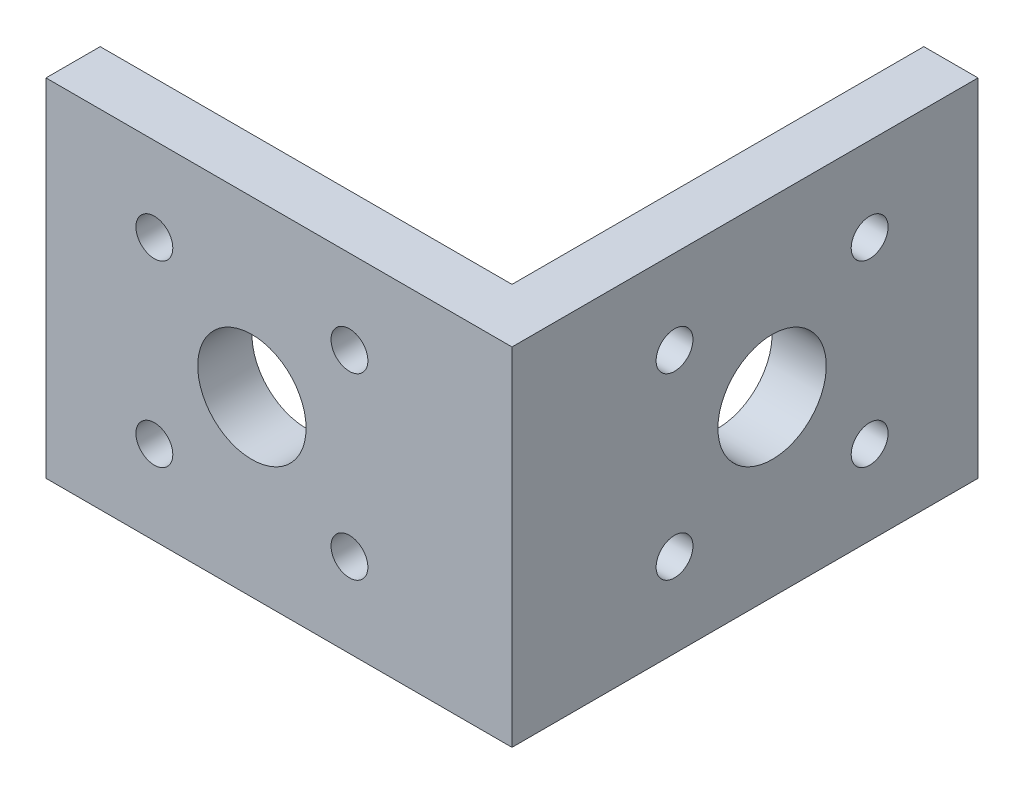
ISO-10303-21;
HEADER;
FILE_DESCRIPTION(('STEP AP214'),'2;1');
FILE_NAME('part.step','',(''),(''),'','','');
FILE_SCHEMA(('AUTOMOTIVE_DESIGN { 1 0 10303 214 1 1 1 1 }'));
ENDSEC;
DATA;
#1=APPLICATION_CONTEXT('core data for automotive mechanical design processes');
#2=APPLICATION_PROTOCOL_DEFINITION('international standard','automotive_design',2000,#1);
#3=PRODUCT_CONTEXT('',#1,'mechanical');
#4=PRODUCT('Part','Part','',(#3));
#5=PRODUCT_RELATED_PRODUCT_CATEGORY('part','',(#4));
#6=PRODUCT_DEFINITION_FORMATION('','',#4);
#7=PRODUCT_DEFINITION_CONTEXT('part definition',#1,'design');
#8=PRODUCT_DEFINITION('design','',#6,#7);
#9=PRODUCT_DEFINITION_SHAPE('','',#8);
#10=(LENGTH_UNIT() NAMED_UNIT(*) SI_UNIT(.MILLI.,.METRE.));
#11=(NAMED_UNIT(*) PLANE_ANGLE_UNIT() SI_UNIT($,.RADIAN.));
#12=(NAMED_UNIT(*) SI_UNIT($,.STERADIAN.) SOLID_ANGLE_UNIT());
#13=UNCERTAINTY_MEASURE_WITH_UNIT(LENGTH_MEASURE(1.E-05),#10,'distance_accuracy_value','');
#14=(GEOMETRIC_REPRESENTATION_CONTEXT(3) GLOBAL_UNCERTAINTY_ASSIGNED_CONTEXT((#13)) GLOBAL_UNIT_ASSIGNED_CONTEXT((#10,
#11,#12)) REPRESENTATION_CONTEXT('',''));
#15=CARTESIAN_POINT('',(0.,0.,0.));
#16=DIRECTION('',(0.,0.,1.));
#17=DIRECTION('',(1.,0.,0.));
#18=AXIS2_PLACEMENT_3D('',#15,#16,#17);
#19=CARTESIAN_POINT('',(0.,0.,0.));
#20=DIRECTION('',(0.,0.,1.));
#21=DIRECTION('',(1.,0.,0.));
#22=AXIS2_PLACEMENT_3D('',#19,#20,#21);
#23=PLANE('',#22);
#24=CARTESIAN_POINT('',(-8.99999999999983,-8.25,0.));
#25=DIRECTION('',(0.,0.,1.));
#26=DIRECTION('',(1.,0.,0.));
#27=AXIS2_PLACEMENT_3D('',#24,#25,#26);
#28=CIRCLE('',#27,1.7);
#29=CARTESIAN_POINT('',(-7.29999999999983,-8.25,0.));
#30=VERTEX_POINT('',#29);
#31=EDGE_CURVE('E143',#30,#30,#28,.T.);
#32=ORIENTED_EDGE('',*,*,#31,.T.);
#33=EDGE_LOOP('',(#32));
#34=FACE_BOUND('',#33,.T.);
#35=CARTESIAN_POINT('',(9.00000000000017,-8.24999999999975,0.));
#36=DIRECTION('',(0.,0.,1.));
#37=DIRECTION('',(1.,0.,0.));
#38=AXIS2_PLACEMENT_3D('',#35,#36,#37);
#39=CIRCLE('',#38,1.7);
#40=CARTESIAN_POINT('',(10.7000000000002,-8.24999999999975,0.));
#41=VERTEX_POINT('',#40);
#42=EDGE_CURVE('E135',#41,#41,#39,.T.);
#43=ORIENTED_EDGE('',*,*,#42,.T.);
#44=EDGE_LOOP('',(#43));
#45=FACE_BOUND('',#44,.T.);
#46=CARTESIAN_POINT('',(9.,8.25000000000025,0.));
#47=DIRECTION('',(0.,0.,1.));
#48=DIRECTION('',(1.,0.,0.));
#49=AXIS2_PLACEMENT_3D('',#46,#47,#48);
#50=CIRCLE('',#49,1.7);
#51=CARTESIAN_POINT('',(10.7,8.25000000000025,0.));
#52=VERTEX_POINT('',#51);
#53=EDGE_CURVE('E127',#52,#52,#50,.T.);
#54=ORIENTED_EDGE('',*,*,#53,.T.);
#55=EDGE_LOOP('',(#54));
#56=FACE_BOUND('',#55,.T.);
#57=CARTESIAN_POINT('',(-9.00000000000001,8.24999999999988,0.));
#58=DIRECTION('',(0.,0.,1.));
#59=DIRECTION('',(1.,0.,0.));
#60=AXIS2_PLACEMENT_3D('',#57,#58,#59);
#61=CIRCLE('',#60,1.70000000000004);
#62=CARTESIAN_POINT('',(-7.29999999999997,8.24999999999988,0.));
#63=VERTEX_POINT('',#62);
#64=EDGE_CURVE('E119',#63,#63,#61,.T.);
#65=ORIENTED_EDGE('',*,*,#64,.T.);
#66=EDGE_LOOP('',(#65));
#67=FACE_BOUND('',#66,.T.);
#68=CARTESIAN_POINT('',(0.,0.,0.));
#69=DIRECTION('',(0.,0.,1.));
#70=DIRECTION('',(1.,0.,0.));
#71=AXIS2_PLACEMENT_3D('',#68,#69,#70);
#72=CIRCLE('',#71,5.);
#73=CARTESIAN_POINT('',(4.99999999999999,0.,0.));
#74=VERTEX_POINT('',#73);
#75=EDGE_CURVE('E111',#74,#74,#72,.T.);
#76=ORIENTED_EDGE('',*,*,#75,.T.);
#77=EDGE_LOOP('',(#76));
#78=FACE_BOUND('',#77,.T.);
#79=DIRECTION('',(0.,1.,0.));
#80=VECTOR('',#79,1.);
#81=CARTESIAN_POINT('',(19.,16.,0.));
#82=LINE('',#81,#80);
#83=CARTESIAN_POINT('',(19.,-16.,0.));
#84=VERTEX_POINT('',#83);
#85=CARTESIAN_POINT('',(19.,16.,0.));
#86=VERTEX_POINT('',#85);
#87=EDGE_CURVE('E61',#84,#86,#82,.T.);
#88=ORIENTED_EDGE('',*,*,#87,.F.);
#89=DIRECTION('',(1.,0.,0.));
#90=VECTOR('',#89,1.);
#91=CARTESIAN_POINT('',(-19.,-16.,0.));
#92=LINE('',#91,#90);
#93=CARTESIAN_POINT('',(-19.,-16.,0.));
#94=VERTEX_POINT('',#93);
#95=EDGE_CURVE('E88',#94,#84,#92,.T.);
#96=ORIENTED_EDGE('',*,*,#95,.F.);
#97=DIRECTION('',(0.,-1.,0.));
#98=VECTOR('',#97,1.);
#99=CARTESIAN_POINT('',(-19.,16.,0.));
#100=LINE('',#99,#98);
#101=CARTESIAN_POINT('',(-19.,16.,0.));
#102=VERTEX_POINT('',#101);
#103=EDGE_CURVE('E82',#102,#94,#100,.T.);
#104=ORIENTED_EDGE('',*,*,#103,.F.);
#105=DIRECTION('',(-1.,0.,0.));
#106=VECTOR('',#105,1.);
#107=CARTESIAN_POINT('',(-19.,16.,0.));
#108=LINE('',#107,#106);
#109=EDGE_CURVE('E89',#86,#102,#108,.T.);
#110=ORIENTED_EDGE('',*,*,#109,.F.);
#111=EDGE_LOOP('',(#88,#96,#104,#110));
#112=FACE_BOUND('',#111,.T.);
#113=ADVANCED_FACE('F45',(#34,#45,#56,#67,#78,#112),#23,.F.);
#114=CARTESIAN_POINT('',(0.,0.,5.));
#115=DIRECTION('',(0.,0.,1.));
#116=DIRECTION('',(1.,0.,0.));
#117=AXIS2_PLACEMENT_3D('',#114,#115,#116);
#118=PLANE('',#117);
#119=CARTESIAN_POINT('',(9.00000000000017,-8.24999999999975,5.));
#120=DIRECTION('',(0.,0.,1.));
#121=DIRECTION('',(1.,0.,0.));
#122=AXIS2_PLACEMENT_3D('',#119,#120,#121);
#123=CIRCLE('',#122,1.7);
#124=CARTESIAN_POINT('',(10.7000000000002,-8.24999999999975,5.));
#125=VERTEX_POINT('',#124);
#126=EDGE_CURVE('E131',#125,#125,#123,.T.);
#127=ORIENTED_EDGE('',*,*,#126,.F.);
#128=EDGE_LOOP('',(#127));
#129=FACE_BOUND('',#128,.T.);
#130=CARTESIAN_POINT('',(-9.00000000000001,8.24999999999988,5.));
#131=DIRECTION('',(0.,0.,1.));
#132=DIRECTION('',(1.,0.,0.));
#133=AXIS2_PLACEMENT_3D('',#130,#131,#132);
#134=CIRCLE('',#133,1.70000000000004);
#135=CARTESIAN_POINT('',(-7.29999999999997,8.24999999999988,5.));
#136=VERTEX_POINT('',#135);
#137=EDGE_CURVE('E115',#136,#136,#134,.T.);
#138=ORIENTED_EDGE('',*,*,#137,.F.);
#139=EDGE_LOOP('',(#138));
#140=FACE_BOUND('',#139,.T.);
#141=DIRECTION('',(1.,0.,0.));
#142=VECTOR('',#141,1.);
#143=CARTESIAN_POINT('',(-19.,-16.,5.));
#144=LINE('',#143,#142);
#145=CARTESIAN_POINT('',(-19.,-16.,5.));
#146=VERTEX_POINT('',#145);
#147=CARTESIAN_POINT('',(24.,-16.,5.));
#148=VERTEX_POINT('',#147);
#149=EDGE_CURVE('E96',#146,#148,#144,.T.);
#150=ORIENTED_EDGE('',*,*,#149,.T.);
#151=DIRECTION('',(0.,1.,0.));
#152=VECTOR('',#151,1.);
#153=CARTESIAN_POINT('',(24.,16.,5.));
#154=LINE('',#153,#152);
#155=CARTESIAN_POINT('',(24.,16.,5.));
#156=VERTEX_POINT('',#155);
#157=EDGE_CURVE('E158',#148,#156,#154,.T.);
#158=ORIENTED_EDGE('',*,*,#157,.T.);
#159=DIRECTION('',(-1.,0.,0.));
#160=VECTOR('',#159,1.);
#161=CARTESIAN_POINT('',(-19.,16.,5.));
#162=LINE('',#161,#160);
#163=CARTESIAN_POINT('',(-19.,16.,5.));
#164=VERTEX_POINT('',#163);
#165=EDGE_CURVE('E99',#156,#164,#162,.T.);
#166=ORIENTED_EDGE('',*,*,#165,.T.);
#167=DIRECTION('',(0.,-1.,0.));
#168=VECTOR('',#167,1.);
#169=CARTESIAN_POINT('',(-19.,16.,5.));
#170=LINE('',#169,#168);
#171=EDGE_CURVE('E70',#164,#146,#170,.T.);
#172=ORIENTED_EDGE('',*,*,#171,.T.);
#173=EDGE_LOOP('',(#150,#158,#166,#172));
#174=FACE_BOUND('',#173,.T.);
#175=CARTESIAN_POINT('',(0.,0.,5.));
#176=DIRECTION('',(0.,0.,1.));
#177=DIRECTION('',(1.,0.,0.));
#178=AXIS2_PLACEMENT_3D('',#175,#176,#177);
#179=CIRCLE('',#178,5.);
#180=CARTESIAN_POINT('',(4.99999999999999,0.,5.));
#181=VERTEX_POINT('',#180);
#182=EDGE_CURVE('E106',#181,#181,#179,.T.);
#183=ORIENTED_EDGE('',*,*,#182,.F.);
#184=EDGE_LOOP('',(#183));
#185=FACE_BOUND('',#184,.T.);
#186=CARTESIAN_POINT('',(9.,8.25000000000025,5.));
#187=DIRECTION('',(0.,0.,1.));
#188=DIRECTION('',(1.,0.,0.));
#189=AXIS2_PLACEMENT_3D('',#186,#187,#188);
#190=CIRCLE('',#189,1.7);
#191=CARTESIAN_POINT('',(10.7,8.25000000000025,5.));
#192=VERTEX_POINT('',#191);
#193=EDGE_CURVE('E123',#192,#192,#190,.T.);
#194=ORIENTED_EDGE('',*,*,#193,.F.);
#195=EDGE_LOOP('',(#194));
#196=FACE_BOUND('',#195,.T.);
#197=CARTESIAN_POINT('',(-8.99999999999983,-8.25,5.));
#198=DIRECTION('',(0.,0.,1.));
#199=DIRECTION('',(1.,0.,0.));
#200=AXIS2_PLACEMENT_3D('',#197,#198,#199);
#201=CIRCLE('',#200,1.7);
#202=CARTESIAN_POINT('',(-7.29999999999983,-8.25,5.));
#203=VERTEX_POINT('',#202);
#204=EDGE_CURVE('E139',#203,#203,#201,.T.);
#205=ORIENTED_EDGE('',*,*,#204,.F.);
#206=EDGE_LOOP('',(#205));
#207=FACE_BOUND('',#206,.T.);
#208=ADVANCED_FACE('F274',(#129,#140,#174,#185,#196,#207),#118,.T.);
#209=CARTESIAN_POINT('',(-19.,16.,5.));
#210=DIRECTION('',(0.,-1.,0.));
#211=DIRECTION('',(0.,0.,-1.));
#212=AXIS2_PLACEMENT_3D('',#209,#210,#211);
#213=PLANE('',#212);
#214=DIRECTION('',(0.,0.,-1.));
#215=VECTOR('',#214,1.);
#216=CARTESIAN_POINT('',(24.,16.,5.));
#217=LINE('',#216,#215);
#218=CARTESIAN_POINT('',(24.,16.,-38.));
#219=VERTEX_POINT('',#218);
#220=EDGE_CURVE('E154',#156,#219,#217,.T.);
#221=ORIENTED_EDGE('',*,*,#220,.T.);
#222=DIRECTION('',(-1.,0.,0.));
#223=VECTOR('',#222,1.);
#224=CARTESIAN_POINT('',(24.,16.,-38.));
#225=LINE('',#224,#223);
#226=CARTESIAN_POINT('',(19.,16.,-38.));
#227=VERTEX_POINT('',#226);
#228=EDGE_CURVE('E166',#219,#227,#225,.T.);
#229=ORIENTED_EDGE('',*,*,#228,.T.);
#230=DIRECTION('',(0.,0.,-1.));
#231=VECTOR('',#230,1.);
#232=CARTESIAN_POINT('',(19.,16.,-38.));
#233=LINE('',#232,#231);
#234=EDGE_CURVE('E171',#86,#227,#233,.T.);
#235=ORIENTED_EDGE('',*,*,#234,.F.);
#236=ORIENTED_EDGE('',*,*,#109,.T.);
#237=DIRECTION('',(0.,0.,-1.));
#238=VECTOR('',#237,1.);
#239=CARTESIAN_POINT('',(-19.,16.,5.));
#240=LINE('',#239,#238);
#241=EDGE_CURVE('E11',#164,#102,#240,.T.);
#242=ORIENTED_EDGE('',*,*,#241,.F.);
#243=ORIENTED_EDGE('',*,*,#165,.F.);
#244=EDGE_LOOP('',(#221,#229,#235,#236,#242,#243));
#245=FACE_BOUND('',#244,.T.);
#246=ADVANCED_FACE('F47',(#245),#213,.F.);
#247=CARTESIAN_POINT('',(-19.,16.,5.));
#248=DIRECTION('',(1.,0.,0.));
#249=DIRECTION('',(0.,0.,-1.));
#250=AXIS2_PLACEMENT_3D('',#247,#248,#249);
#251=PLANE('',#250);
#252=ORIENTED_EDGE('',*,*,#103,.T.);
#253=DIRECTION('',(0.,0.,-1.));
#254=VECTOR('',#253,1.);
#255=CARTESIAN_POINT('',(-19.,-16.,5.));
#256=LINE('',#255,#254);
#257=EDGE_CURVE('E54',#146,#94,#256,.T.);
#258=ORIENTED_EDGE('',*,*,#257,.F.);
#259=ORIENTED_EDGE('',*,*,#171,.F.);
#260=ORIENTED_EDGE('',*,*,#241,.T.);
#261=EDGE_LOOP('',(#252,#258,#259,#260));
#262=FACE_BOUND('',#261,.T.);
#263=ADVANCED_FACE('F84',(#262),#251,.F.);
#264=CARTESIAN_POINT('',(-19.,-16.,5.));
#265=DIRECTION('',(0.,1.,0.));
#266=DIRECTION('',(0.,0.,1.));
#267=AXIS2_PLACEMENT_3D('',#264,#265,#266);
#268=PLANE('',#267);
#269=ORIENTED_EDGE('',*,*,#95,.T.);
#270=DIRECTION('',(0.,0.,1.));
#271=VECTOR('',#270,1.);
#272=CARTESIAN_POINT('',(19.,-16.,-38.));
#273=LINE('',#272,#271);
#274=CARTESIAN_POINT('',(19.,-16.,-38.));
#275=VERTEX_POINT('',#274);
#276=EDGE_CURVE('E179',#275,#84,#273,.T.);
#277=ORIENTED_EDGE('',*,*,#276,.F.);
#278=DIRECTION('',(-1.,0.,0.));
#279=VECTOR('',#278,1.);
#280=CARTESIAN_POINT('',(24.,-16.,-38.));
#281=LINE('',#280,#279);
#282=CARTESIAN_POINT('',(24.,-16.,-38.));
#283=VERTEX_POINT('',#282);
#284=EDGE_CURVE('E162',#283,#275,#281,.T.);
#285=ORIENTED_EDGE('',*,*,#284,.F.);
#286=DIRECTION('',(0.,0.,-1.));
#287=VECTOR('',#286,1.);
#288=CARTESIAN_POINT('',(24.,-16.,5.));
#289=LINE('',#288,#287);
#290=EDGE_CURVE('E147',#148,#283,#289,.T.);
#291=ORIENTED_EDGE('',*,*,#290,.F.);
#292=ORIENTED_EDGE('',*,*,#149,.F.);
#293=ORIENTED_EDGE('',*,*,#257,.T.);
#294=EDGE_LOOP('',(#269,#277,#285,#291,#292,#293));
#295=FACE_BOUND('',#294,.T.);
#296=ADVANCED_FACE('F92',(#295),#268,.F.);
#297=CARTESIAN_POINT('',(0.,0.,5.));
#298=DIRECTION('',(0.,0.,-1.));
#299=DIRECTION('',(-1.,0.,0.));
#300=AXIS2_PLACEMENT_3D('',#297,#298,#299);
#301=CYLINDRICAL_SURFACE('',#300,5.);
#302=ORIENTED_EDGE('',*,*,#182,.T.);
#303=EDGE_LOOP('',(#302));
#304=FACE_BOUND('',#303,.T.);
#305=ORIENTED_EDGE('',*,*,#75,.F.);
#306=EDGE_LOOP('',(#305));
#307=FACE_BOUND('',#306,.T.);
#308=ADVANCED_FACE('F301',(#304,#307),#301,.F.);
#309=CARTESIAN_POINT('',(-9.00000000000001,8.24999999999988,5.));
#310=DIRECTION('',(0.,0.,-1.));
#311=DIRECTION('',(-1.,0.,0.));
#312=AXIS2_PLACEMENT_3D('',#309,#310,#311);
#313=CYLINDRICAL_SURFACE('',#312,1.70000000000004);
#314=ORIENTED_EDGE('',*,*,#137,.T.);
#315=EDGE_LOOP('',(#314));
#316=FACE_BOUND('',#315,.T.);
#317=ORIENTED_EDGE('',*,*,#64,.F.);
#318=EDGE_LOOP('',(#317));
#319=FACE_BOUND('',#318,.T.);
#320=ADVANCED_FACE('F418',(#316,#319),#313,.F.);
#321=CARTESIAN_POINT('',(9.,8.25000000000025,5.));
#322=DIRECTION('',(0.,0.,-1.));
#323=DIRECTION('',(-1.,0.,0.));
#324=AXIS2_PLACEMENT_3D('',#321,#322,#323);
#325=CYLINDRICAL_SURFACE('',#324,1.7);
#326=ORIENTED_EDGE('',*,*,#193,.T.);
#327=EDGE_LOOP('',(#326));
#328=FACE_BOUND('',#327,.T.);
#329=ORIENTED_EDGE('',*,*,#53,.F.);
#330=EDGE_LOOP('',(#329));
#331=FACE_BOUND('',#330,.T.);
#332=ADVANCED_FACE('F409',(#328,#331),#325,.F.);
#333=CARTESIAN_POINT('',(9.00000000000017,-8.24999999999975,5.));
#334=DIRECTION('',(0.,0.,-1.));
#335=DIRECTION('',(-1.,0.,0.));
#336=AXIS2_PLACEMENT_3D('',#333,#334,#335);
#337=CYLINDRICAL_SURFACE('',#336,1.7);
#338=ORIENTED_EDGE('',*,*,#126,.T.);
#339=EDGE_LOOP('',(#338));
#340=FACE_BOUND('',#339,.T.);
#341=ORIENTED_EDGE('',*,*,#42,.F.);
#342=EDGE_LOOP('',(#341));
#343=FACE_BOUND('',#342,.T.);
#344=ADVANCED_FACE('F286',(#340,#343),#337,.F.);
#345=CARTESIAN_POINT('',(-8.99999999999983,-8.25,5.));
#346=DIRECTION('',(0.,0.,-1.));
#347=DIRECTION('',(-1.,0.,0.));
#348=AXIS2_PLACEMENT_3D('',#345,#346,#347);
#349=CYLINDRICAL_SURFACE('',#348,1.7);
#350=ORIENTED_EDGE('',*,*,#204,.T.);
#351=EDGE_LOOP('',(#350));
#352=FACE_BOUND('',#351,.T.);
#353=ORIENTED_EDGE('',*,*,#31,.F.);
#354=EDGE_LOOP('',(#353));
#355=FACE_BOUND('',#354,.T.);
#356=ADVANCED_FACE('F278',(#352,#355),#349,.F.);
#357=CARTESIAN_POINT('',(24.,16.,5.));
#358=DIRECTION('',(-1.,0.,0.));
#359=DIRECTION('',(0.,-1.,0.));
#360=AXIS2_PLACEMENT_3D('',#357,#358,#359);
#361=PLANE('',#360);
#362=ORIENTED_EDGE('',*,*,#290,.T.);
#363=DIRECTION('',(0.,-1.,0.));
#364=VECTOR('',#363,1.);
#365=CARTESIAN_POINT('',(24.,16.,-38.));
#366=LINE('',#365,#364);
#367=EDGE_CURVE('E170',#219,#283,#366,.T.);
#368=ORIENTED_EDGE('',*,*,#367,.F.);
#369=ORIENTED_EDGE('',*,*,#220,.F.);
#370=ORIENTED_EDGE('',*,*,#157,.F.);
#371=EDGE_LOOP('',(#362,#368,#369,#370));
#372=FACE_BOUND('',#371,.T.);
#373=CARTESIAN_POINT('',(24.,-8.24999999999999,-27.9999999999998));
#374=DIRECTION('',(-1.,0.,0.));
#375=DIRECTION('',(0.,0.,1.));
#376=AXIS2_PLACEMENT_3D('',#373,#374,#375);
#377=CIRCLE('',#376,1.7);
#378=CARTESIAN_POINT('',(24.,-8.24999999999999,-26.2999999999998));
#379=VERTEX_POINT('',#378);
#380=EDGE_CURVE('E216',#379,#379,#377,.T.);
#381=ORIENTED_EDGE('',*,*,#380,.T.);
#382=EDGE_LOOP('',(#381));
#383=FACE_BOUND('',#382,.T.);
#384=CARTESIAN_POINT('',(24.,-8.24999999999975,-9.99999999999984));
#385=DIRECTION('',(-1.,0.,0.));
#386=DIRECTION('',(0.,0.,1.));
#387=AXIS2_PLACEMENT_3D('',#384,#385,#386);
#388=CIRCLE('',#387,1.7);
#389=CARTESIAN_POINT('',(24.,-8.24999999999975,-8.29999999999984));
#390=VERTEX_POINT('',#389);
#391=EDGE_CURVE('E208',#390,#390,#388,.T.);
#392=ORIENTED_EDGE('',*,*,#391,.T.);
#393=EDGE_LOOP('',(#392));
#394=FACE_BOUND('',#393,.T.);
#395=CARTESIAN_POINT('',(24.,8.25000000000026,-10.));
#396=DIRECTION('',(-1.,0.,0.));
#397=DIRECTION('',(0.,0.,1.));
#398=AXIS2_PLACEMENT_3D('',#395,#396,#397);
#399=CIRCLE('',#398,1.7);
#400=CARTESIAN_POINT('',(24.,8.25000000000026,-8.30000000000001));
#401=VERTEX_POINT('',#400);
#402=EDGE_CURVE('E200',#401,#401,#399,.T.);
#403=ORIENTED_EDGE('',*,*,#402,.T.);
#404=EDGE_LOOP('',(#403));
#405=FACE_BOUND('',#404,.T.);
#406=CARTESIAN_POINT('',(24.,8.24999999999989,-28.));
#407=DIRECTION('',(-1.,0.,0.));
#408=DIRECTION('',(0.,0.,1.));
#409=AXIS2_PLACEMENT_3D('',#406,#407,#408);
#410=CIRCLE('',#409,1.70000000000004);
#411=CARTESIAN_POINT('',(24.,8.24999999999989,-26.3));
#412=VERTEX_POINT('',#411);
#413=EDGE_CURVE('E192',#412,#412,#410,.T.);
#414=ORIENTED_EDGE('',*,*,#413,.T.);
#415=EDGE_LOOP('',(#414));
#416=FACE_BOUND('',#415,.T.);
#417=CARTESIAN_POINT('',(24.,0.,-19.));
#418=DIRECTION('',(-1.,0.,0.));
#419=DIRECTION('',(0.,0.,1.));
#420=AXIS2_PLACEMENT_3D('',#417,#418,#419);
#421=CIRCLE('',#420,5.);
#422=CARTESIAN_POINT('',(24.,0.,-14.));
#423=VERTEX_POINT('',#422);
#424=EDGE_CURVE('E184',#423,#423,#421,.T.);
#425=ORIENTED_EDGE('',*,*,#424,.T.);
#426=EDGE_LOOP('',(#425));
#427=FACE_BOUND('',#426,.T.);
#428=ADVANCED_FACE('F228',(#372,#383,#394,#405,#416,#427),#361,.F.);
#429=CARTESIAN_POINT('',(24.,16.,-38.));
#430=DIRECTION('',(0.,0.,-1.));
#431=DIRECTION('',(-1.,0.,0.));
#432=AXIS2_PLACEMENT_3D('',#429,#430,#431);
#433=PLANE('',#432);
#434=DIRECTION('',(0.,-1.,0.));
#435=VECTOR('',#434,1.);
#436=CARTESIAN_POINT('',(19.,16.,-38.));
#437=LINE('',#436,#435);
#438=EDGE_CURVE('E175',#227,#275,#437,.T.);
#439=ORIENTED_EDGE('',*,*,#438,.F.);
#440=ORIENTED_EDGE('',*,*,#228,.F.);
#441=ORIENTED_EDGE('',*,*,#367,.T.);
#442=ORIENTED_EDGE('',*,*,#284,.T.);
#443=EDGE_LOOP('',(#439,#440,#441,#442));
#444=FACE_BOUND('',#443,.T.);
#445=ADVANCED_FACE('F242',(#444),#433,.T.);
#446=CARTESIAN_POINT('',(19.,0.,-19.));
#447=DIRECTION('',(1.,0.,0.));
#448=DIRECTION('',(0.,0.,1.));
#449=AXIS2_PLACEMENT_3D('',#446,#447,#448);
#450=PLANE('',#449);
#451=CARTESIAN_POINT('',(19.,-8.24999999999999,-27.9999999999998));
#452=DIRECTION('',(-1.,0.,0.));
#453=DIRECTION('',(0.,0.,1.));
#454=AXIS2_PLACEMENT_3D('',#451,#452,#453);
#455=CIRCLE('',#454,1.7);
#456=CARTESIAN_POINT('',(19.,-8.24999999999999,-26.2999999999998));
#457=VERTEX_POINT('',#456);
#458=EDGE_CURVE('E220',#457,#457,#455,.T.);
#459=ORIENTED_EDGE('',*,*,#458,.F.);
#460=EDGE_LOOP('',(#459));
#461=FACE_BOUND('',#460,.T.);
#462=CARTESIAN_POINT('',(19.,-8.24999999999975,-9.99999999999984));
#463=DIRECTION('',(-1.,0.,0.));
#464=DIRECTION('',(0.,0.,1.));
#465=AXIS2_PLACEMENT_3D('',#462,#463,#464);
#466=CIRCLE('',#465,1.7);
#467=CARTESIAN_POINT('',(19.,-8.24999999999975,-8.29999999999984));
#468=VERTEX_POINT('',#467);
#469=EDGE_CURVE('E212',#468,#468,#466,.T.);
#470=ORIENTED_EDGE('',*,*,#469,.F.);
#471=EDGE_LOOP('',(#470));
#472=FACE_BOUND('',#471,.T.);
#473=CARTESIAN_POINT('',(19.,8.25000000000026,-10.));
#474=DIRECTION('',(-1.,0.,0.));
#475=DIRECTION('',(0.,0.,1.));
#476=AXIS2_PLACEMENT_3D('',#473,#474,#475);
#477=CIRCLE('',#476,1.7);
#478=CARTESIAN_POINT('',(19.,8.25000000000026,-8.30000000000001));
#479=VERTEX_POINT('',#478);
#480=EDGE_CURVE('E204',#479,#479,#477,.T.);
#481=ORIENTED_EDGE('',*,*,#480,.F.);
#482=EDGE_LOOP('',(#481));
#483=FACE_BOUND('',#482,.T.);
#484=CARTESIAN_POINT('',(19.,8.24999999999989,-28.));
#485=DIRECTION('',(-1.,0.,0.));
#486=DIRECTION('',(0.,0.,1.));
#487=AXIS2_PLACEMENT_3D('',#484,#485,#486);
#488=CIRCLE('',#487,1.70000000000004);
#489=CARTESIAN_POINT('',(19.,8.24999999999989,-26.3));
#490=VERTEX_POINT('',#489);
#491=EDGE_CURVE('E196',#490,#490,#488,.T.);
#492=ORIENTED_EDGE('',*,*,#491,.F.);
#493=EDGE_LOOP('',(#492));
#494=FACE_BOUND('',#493,.T.);
#495=CARTESIAN_POINT('',(19.,0.,-19.));
#496=DIRECTION('',(-1.,0.,0.));
#497=DIRECTION('',(0.,0.,1.));
#498=AXIS2_PLACEMENT_3D('',#495,#496,#497);
#499=CIRCLE('',#498,5.);
#500=CARTESIAN_POINT('',(19.,0.,-14.));
#501=VERTEX_POINT('',#500);
#502=EDGE_CURVE('E188',#501,#501,#499,.T.);
#503=ORIENTED_EDGE('',*,*,#502,.F.);
#504=EDGE_LOOP('',(#503));
#505=FACE_BOUND('',#504,.T.);
#506=ORIENTED_EDGE('',*,*,#87,.T.);
#507=ORIENTED_EDGE('',*,*,#234,.T.);
#508=ORIENTED_EDGE('',*,*,#438,.T.);
#509=ORIENTED_EDGE('',*,*,#276,.T.);
#510=EDGE_LOOP('',(#506,#507,#508,#509));
#511=FACE_BOUND('',#510,.T.);
#512=ADVANCED_FACE('F238',(#461,#472,#483,#494,#505,#511),#450,.F.);
#513=CARTESIAN_POINT('',(24.,0.,-19.));
#514=DIRECTION('',(-1.,0.,0.));
#515=DIRECTION('',(0.,0.,1.));
#516=AXIS2_PLACEMENT_3D('',#513,#514,#515);
#517=CYLINDRICAL_SURFACE('',#516,5.);
#518=ORIENTED_EDGE('',*,*,#424,.F.);
#519=EDGE_LOOP('',(#518));
#520=FACE_BOUND('',#519,.T.);
#521=ORIENTED_EDGE('',*,*,#502,.T.);
#522=EDGE_LOOP('',(#521));
#523=FACE_BOUND('',#522,.T.);
#524=ADVANCED_FACE('F241',(#520,#523),#517,.F.);
#525=CARTESIAN_POINT('',(24.,8.24999999999989,-28.));
#526=DIRECTION('',(-1.,0.,0.));
#527=DIRECTION('',(0.,0.,1.));
#528=AXIS2_PLACEMENT_3D('',#525,#526,#527);
#529=CYLINDRICAL_SURFACE('',#528,1.70000000000004);
#530=ORIENTED_EDGE('',*,*,#413,.F.);
#531=EDGE_LOOP('',(#530));
#532=FACE_BOUND('',#531,.T.);
#533=ORIENTED_EDGE('',*,*,#491,.T.);
#534=EDGE_LOOP('',(#533));
#535=FACE_BOUND('',#534,.T.);
#536=ADVANCED_FACE('F345',(#532,#535),#529,.F.);
#537=CARTESIAN_POINT('',(24.,8.25000000000026,-10.));
#538=DIRECTION('',(-1.,0.,0.));
#539=DIRECTION('',(0.,0.,1.));
#540=AXIS2_PLACEMENT_3D('',#537,#538,#539);
#541=CYLINDRICAL_SURFACE('',#540,1.7);
#542=ORIENTED_EDGE('',*,*,#402,.F.);
#543=EDGE_LOOP('',(#542));
#544=FACE_BOUND('',#543,.T.);
#545=ORIENTED_EDGE('',*,*,#480,.T.);
#546=EDGE_LOOP('',(#545));
#547=FACE_BOUND('',#546,.T.);
#548=ADVANCED_FACE('F355',(#544,#547),#541,.F.);
#549=CARTESIAN_POINT('',(24.,-8.24999999999975,-9.99999999999984));
#550=DIRECTION('',(-1.,0.,0.));
#551=DIRECTION('',(0.,0.,1.));
#552=AXIS2_PLACEMENT_3D('',#549,#550,#551);
#553=CYLINDRICAL_SURFACE('',#552,1.7);
#554=ORIENTED_EDGE('',*,*,#391,.F.);
#555=EDGE_LOOP('',(#554));
#556=FACE_BOUND('',#555,.T.);
#557=ORIENTED_EDGE('',*,*,#469,.T.);
#558=EDGE_LOOP('',(#557));
#559=FACE_BOUND('',#558,.T.);
#560=ADVANCED_FACE('F234',(#556,#559),#553,.F.);
#561=CARTESIAN_POINT('',(24.,-8.24999999999999,-27.9999999999998));
#562=DIRECTION('',(-1.,0.,0.));
#563=DIRECTION('',(0.,0.,1.));
#564=AXIS2_PLACEMENT_3D('',#561,#562,#563);
#565=CYLINDRICAL_SURFACE('',#564,1.7);
#566=ORIENTED_EDGE('',*,*,#380,.F.);
#567=EDGE_LOOP('',(#566));
#568=FACE_BOUND('',#567,.T.);
#569=ORIENTED_EDGE('',*,*,#458,.T.);
#570=EDGE_LOOP('',(#569));
#571=FACE_BOUND('',#570,.T.);
#572=ADVANCED_FACE('F231',(#568,#571),#565,.F.);
#573=CLOSED_SHELL('',(#113,#208,#246,#263,#296,#308,#320,#332,#344,#356,#428,#445,#512,#524,
#536,#548,#560,#572));
#574=MANIFOLD_SOLID_BREP('B2',#573);
#575=ADVANCED_BREP_SHAPE_REPRESENTATION('',(#18,#574),#14);
#576=SHAPE_DEFINITION_REPRESENTATION(#9,#575);
ENDSEC;
END-ISO-10303-21;
